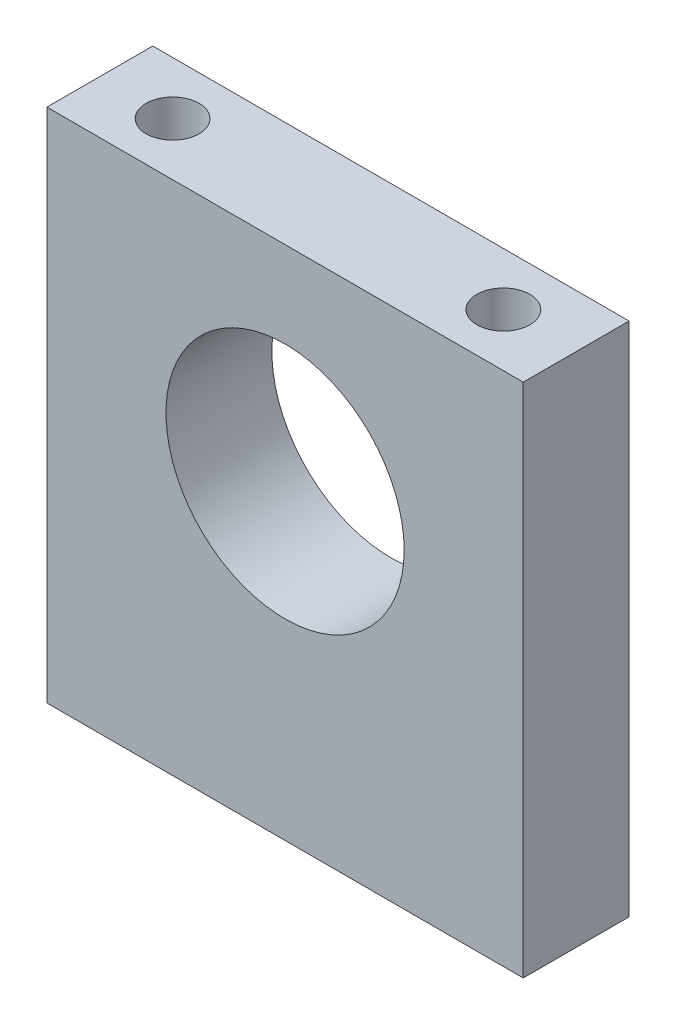
ISO-10303-21;
HEADER;
FILE_DESCRIPTION(('STEP AP214'),'2;1');
FILE_NAME('part.step','',(''),(''),'','','');
FILE_SCHEMA(('AUTOMOTIVE_DESIGN { 1 0 10303 214 1 1 1 1 }'));
ENDSEC;
DATA;
#1=APPLICATION_CONTEXT('core data for automotive mechanical design processes');
#2=APPLICATION_PROTOCOL_DEFINITION('international standard','automotive_design',2000,#1);
#3=PRODUCT_CONTEXT('',#1,'mechanical');
#4=PRODUCT('Part','Part','',(#3));
#5=PRODUCT_RELATED_PRODUCT_CATEGORY('part','',(#4));
#6=PRODUCT_DEFINITION_FORMATION('','',#4);
#7=PRODUCT_DEFINITION_CONTEXT('part definition',#1,'design');
#8=PRODUCT_DEFINITION('design','',#6,#7);
#9=PRODUCT_DEFINITION_SHAPE('','',#8);
#10=(LENGTH_UNIT() NAMED_UNIT(*) SI_UNIT(.MILLI.,.METRE.));
#11=(NAMED_UNIT(*) PLANE_ANGLE_UNIT() SI_UNIT($,.RADIAN.));
#12=(NAMED_UNIT(*) SI_UNIT($,.STERADIAN.) SOLID_ANGLE_UNIT());
#13=UNCERTAINTY_MEASURE_WITH_UNIT(LENGTH_MEASURE(1.E-05),#10,'distance_accuracy_value','');
#14=(GEOMETRIC_REPRESENTATION_CONTEXT(3) GLOBAL_UNCERTAINTY_ASSIGNED_CONTEXT((#13)) GLOBAL_UNIT_ASSIGNED_CONTEXT((#10,
#11,#12)) REPRESENTATION_CONTEXT('',''));
#15=CARTESIAN_POINT('',(0.,0.,0.));
#16=DIRECTION('',(0.,0.,1.));
#17=DIRECTION('',(1.,0.,0.));
#18=AXIS2_PLACEMENT_3D('',#15,#16,#17);
#19=CARTESIAN_POINT('',(0.,39.,0.));
#20=DIRECTION('',(0.,1.,0.));
#21=DIRECTION('',(0.,0.,1.));
#22=AXIS2_PLACEMENT_3D('',#19,#20,#21);
#23=PLANE('',#22);
#24=CARTESIAN_POINT('',(12.5,39.,0.));
#25=DIRECTION('',(0.,1.,0.));
#26=DIRECTION('',(0.,0.,1.));
#27=AXIS2_PLACEMENT_3D('',#24,#25,#26);
#28=CIRCLE('',#27,2.);
#29=CARTESIAN_POINT('',(12.5,39.,2.));
#30=VERTEX_POINT('',#29);
#31=EDGE_CURVE('E111',#30,#30,#28,.T.);
#32=ORIENTED_EDGE('',*,*,#31,.F.);
#33=EDGE_LOOP('',(#32));
#34=FACE_BOUND('',#33,.T.);
#35=DIRECTION('',(0.,0.,-1.));
#36=VECTOR('',#35,1.);
#37=CARTESIAN_POINT('',(18.,39.,-4.));
#38=LINE('',#37,#36);
#39=CARTESIAN_POINT('',(18.,39.,4.));
#40=VERTEX_POINT('',#39);
#41=CARTESIAN_POINT('',(18.,39.,-4.));
#42=VERTEX_POINT('',#41);
#43=EDGE_CURVE('E91',#40,#42,#38,.T.);
#44=ORIENTED_EDGE('',*,*,#43,.T.);
#45=DIRECTION('',(-1.,0.,0.));
#46=VECTOR('',#45,1.);
#47=CARTESIAN_POINT('',(-18.,39.,-4.));
#48=LINE('',#47,#46);
#49=CARTESIAN_POINT('',(-18.,39.,-4.));
#50=VERTEX_POINT('',#49);
#51=EDGE_CURVE('E86',#42,#50,#48,.T.);
#52=ORIENTED_EDGE('',*,*,#51,.T.);
#53=DIRECTION('',(0.,0.,1.));
#54=VECTOR('',#53,1.);
#55=CARTESIAN_POINT('',(-18.,39.,-4.));
#56=LINE('',#55,#54);
#57=CARTESIAN_POINT('',(-18.,39.,4.));
#58=VERTEX_POINT('',#57);
#59=EDGE_CURVE('E89',#50,#58,#56,.T.);
#60=ORIENTED_EDGE('',*,*,#59,.T.);
#61=DIRECTION('',(1.,0.,0.));
#62=VECTOR('',#61,1.);
#63=CARTESIAN_POINT('',(-18.,39.,4.));
#64=LINE('',#63,#62);
#65=EDGE_CURVE('E56',#58,#40,#64,.T.);
#66=ORIENTED_EDGE('',*,*,#65,.T.);
#67=EDGE_LOOP('',(#44,#52,#60,#66));
#68=FACE_BOUND('',#67,.T.);
#69=CARTESIAN_POINT('',(-12.5,39.,0.));
#70=DIRECTION('',(0.,1.,0.));
#71=DIRECTION('',(0.,0.,-1.));
#72=AXIS2_PLACEMENT_3D('',#69,#70,#71);
#73=CIRCLE('',#72,2.);
#74=CARTESIAN_POINT('',(-12.5,39.,-1.99999999999999));
#75=VERTEX_POINT('',#74);
#76=EDGE_CURVE('E133',#75,#75,#73,.T.);
#77=ORIENTED_EDGE('',*,*,#76,.F.);
#78=EDGE_LOOP('',(#77));
#79=FACE_BOUND('',#78,.T.);
#80=ADVANCED_FACE('F38',(#34,#68,#79),#23,.T.);
#81=CARTESIAN_POINT('',(0.,0.,0.));
#82=DIRECTION('',(0.,1.,0.));
#83=DIRECTION('',(0.,0.,1.));
#84=AXIS2_PLACEMENT_3D('',#81,#82,#83);
#85=PLANE('',#84);
#86=DIRECTION('',(0.,0.,-1.));
#87=VECTOR('',#86,1.);
#88=CARTESIAN_POINT('',(18.,0.,-4.));
#89=LINE('',#88,#87);
#90=CARTESIAN_POINT('',(18.,0.,4.));
#91=VERTEX_POINT('',#90);
#92=CARTESIAN_POINT('',(18.,0.,-4.));
#93=VERTEX_POINT('',#92);
#94=EDGE_CURVE('E107',#91,#93,#89,.T.);
#95=ORIENTED_EDGE('',*,*,#94,.F.);
#96=DIRECTION('',(1.,0.,0.));
#97=VECTOR('',#96,1.);
#98=CARTESIAN_POINT('',(-18.,0.,4.));
#99=LINE('',#98,#97);
#100=CARTESIAN_POINT('',(-18.,0.,4.));
#101=VERTEX_POINT('',#100);
#102=EDGE_CURVE('E79',#101,#91,#99,.T.);
#103=ORIENTED_EDGE('',*,*,#102,.F.);
#104=DIRECTION('',(0.,0.,1.));
#105=VECTOR('',#104,1.);
#106=CARTESIAN_POINT('',(-18.,0.,-4.));
#107=LINE('',#106,#105);
#108=CARTESIAN_POINT('',(-18.,0.,-4.));
#109=VERTEX_POINT('',#108);
#110=EDGE_CURVE('E73',#109,#101,#107,.T.);
#111=ORIENTED_EDGE('',*,*,#110,.F.);
#112=DIRECTION('',(-1.,0.,0.));
#113=VECTOR('',#112,1.);
#114=CARTESIAN_POINT('',(-18.,0.,-4.));
#115=LINE('',#114,#113);
#116=EDGE_CURVE('E96',#93,#109,#115,.T.);
#117=ORIENTED_EDGE('',*,*,#116,.F.);
#118=EDGE_LOOP('',(#95,#103,#111,#117));
#119=FACE_BOUND('',#118,.T.);
#120=CARTESIAN_POINT('',(12.5,0.,0.));
#121=DIRECTION('',(0.,1.,0.));
#122=DIRECTION('',(0.,0.,1.));
#123=AXIS2_PLACEMENT_3D('',#120,#121,#122);
#124=CIRCLE('',#123,2.);
#125=CARTESIAN_POINT('',(12.5,0.,2.));
#126=VERTEX_POINT('',#125);
#127=EDGE_CURVE('E129',#126,#126,#124,.T.);
#128=ORIENTED_EDGE('',*,*,#127,.T.);
#129=EDGE_LOOP('',(#128));
#130=FACE_BOUND('',#129,.T.);
#131=CARTESIAN_POINT('',(-12.5,0.,0.));
#132=DIRECTION('',(0.,1.,0.));
#133=DIRECTION('',(0.,0.,-1.));
#134=AXIS2_PLACEMENT_3D('',#131,#132,#133);
#135=CIRCLE('',#134,2.);
#136=CARTESIAN_POINT('',(-12.5,0.,-1.99999999999999));
#137=VERTEX_POINT('',#136);
#138=EDGE_CURVE('E137',#137,#137,#135,.T.);
#139=ORIENTED_EDGE('',*,*,#138,.T.);
#140=EDGE_LOOP('',(#139));
#141=FACE_BOUND('',#140,.T.);
#142=ADVANCED_FACE('F124',(#119,#130,#141),#85,.F.);
#143=CARTESIAN_POINT('',(18.,39.,-4.));
#144=DIRECTION('',(-1.,0.,0.));
#145=DIRECTION('',(0.,0.,1.));
#146=AXIS2_PLACEMENT_3D('',#143,#144,#145);
#147=PLANE('',#146);
#148=ORIENTED_EDGE('',*,*,#94,.T.);
#149=DIRECTION('',(0.,-1.,0.));
#150=VECTOR('',#149,1.);
#151=CARTESIAN_POINT('',(18.,39.,-4.));
#152=LINE('',#151,#150);
#153=EDGE_CURVE('E11',#42,#93,#152,.T.);
#154=ORIENTED_EDGE('',*,*,#153,.F.);
#155=ORIENTED_EDGE('',*,*,#43,.F.);
#156=DIRECTION('',(0.,-1.,0.));
#157=VECTOR('',#156,1.);
#158=CARTESIAN_POINT('',(18.,39.,4.));
#159=LINE('',#158,#157);
#160=EDGE_CURVE('E103',#40,#91,#159,.T.);
#161=ORIENTED_EDGE('',*,*,#160,.T.);
#162=EDGE_LOOP('',(#148,#154,#155,#161));
#163=FACE_BOUND('',#162,.T.);
#164=ADVANCED_FACE('F40',(#163),#147,.F.);
#165=CARTESIAN_POINT('',(-18.,39.,-4.));
#166=DIRECTION('',(0.,0.,1.));
#167=DIRECTION('',(1.,0.,0.));
#168=AXIS2_PLACEMENT_3D('',#165,#166,#167);
#169=PLANE('',#168);
#170=CARTESIAN_POINT('',(0.,23.5,-4.));
#171=DIRECTION('',(0.,0.,1.));
#172=DIRECTION('',(1.,0.,0.));
#173=AXIS2_PLACEMENT_3D('',#170,#171,#172);
#174=CIRCLE('',#173,9.);
#175=CARTESIAN_POINT('',(9.,23.5,-4.));
#176=VERTEX_POINT('',#175);
#177=EDGE_CURVE('E141',#176,#176,#174,.T.);
#178=ORIENTED_EDGE('',*,*,#177,.T.);
#179=EDGE_LOOP('',(#178));
#180=FACE_BOUND('',#179,.T.);
#181=ORIENTED_EDGE('',*,*,#116,.T.);
#182=DIRECTION('',(0.,-1.,0.));
#183=VECTOR('',#182,1.);
#184=CARTESIAN_POINT('',(-18.,39.,-4.));
#185=LINE('',#184,#183);
#186=EDGE_CURVE('E48',#50,#109,#185,.T.);
#187=ORIENTED_EDGE('',*,*,#186,.F.);
#188=ORIENTED_EDGE('',*,*,#51,.F.);
#189=ORIENTED_EDGE('',*,*,#153,.T.);
#190=EDGE_LOOP('',(#181,#187,#188,#189));
#191=FACE_BOUND('',#190,.T.);
#192=ADVANCED_FACE('F95',(#180,#191),#169,.F.);
#193=CARTESIAN_POINT('',(-18.,39.,-4.));
#194=DIRECTION('',(1.,0.,0.));
#195=DIRECTION('',(0.,0.,-1.));
#196=AXIS2_PLACEMENT_3D('',#193,#194,#195);
#197=PLANE('',#196);
#198=ORIENTED_EDGE('',*,*,#110,.T.);
#199=DIRECTION('',(0.,-1.,0.));
#200=VECTOR('',#199,1.);
#201=CARTESIAN_POINT('',(-18.,39.,4.));
#202=LINE('',#201,#200);
#203=EDGE_CURVE('E98',#58,#101,#202,.T.);
#204=ORIENTED_EDGE('',*,*,#203,.F.);
#205=ORIENTED_EDGE('',*,*,#59,.F.);
#206=ORIENTED_EDGE('',*,*,#186,.T.);
#207=EDGE_LOOP('',(#198,#204,#205,#206));
#208=FACE_BOUND('',#207,.T.);
#209=ADVANCED_FACE('F99',(#208),#197,.F.);
#210=CARTESIAN_POINT('',(-18.,39.,4.));
#211=DIRECTION('',(0.,0.,-1.));
#212=DIRECTION('',(-1.,0.,0.));
#213=AXIS2_PLACEMENT_3D('',#210,#211,#212);
#214=PLANE('',#213);
#215=CARTESIAN_POINT('',(0.,23.5,4.));
#216=DIRECTION('',(0.,0.,1.));
#217=DIRECTION('',(1.,0.,0.));
#218=AXIS2_PLACEMENT_3D('',#215,#216,#217);
#219=CIRCLE('',#218,9.);
#220=CARTESIAN_POINT('',(9.,23.5,4.));
#221=VERTEX_POINT('',#220);
#222=EDGE_CURVE('E148',#221,#221,#219,.T.);
#223=ORIENTED_EDGE('',*,*,#222,.F.);
#224=EDGE_LOOP('',(#223));
#225=FACE_BOUND('',#224,.T.);
#226=ORIENTED_EDGE('',*,*,#102,.T.);
#227=ORIENTED_EDGE('',*,*,#160,.F.);
#228=ORIENTED_EDGE('',*,*,#65,.F.);
#229=ORIENTED_EDGE('',*,*,#203,.T.);
#230=EDGE_LOOP('',(#226,#227,#228,#229));
#231=FACE_BOUND('',#230,.T.);
#232=ADVANCED_FACE('F121',(#225,#231),#214,.F.);
#233=CARTESIAN_POINT('',(12.5,39.,0.));
#234=DIRECTION('',(0.,-1.,0.));
#235=DIRECTION('',(0.,0.,-1.));
#236=AXIS2_PLACEMENT_3D('',#233,#234,#235);
#237=CYLINDRICAL_SURFACE('',#236,2.);
#238=ORIENTED_EDGE('',*,*,#31,.T.);
#239=EDGE_LOOP('',(#238));
#240=FACE_BOUND('',#239,.T.);
#241=ORIENTED_EDGE('',*,*,#127,.F.);
#242=EDGE_LOOP('',(#241));
#243=FACE_BOUND('',#242,.T.);
#244=ADVANCED_FACE('F157',(#240,#243),#237,.F.);
#245=CARTESIAN_POINT('',(-12.5,39.,0.));
#246=DIRECTION('',(0.,-1.,0.));
#247=DIRECTION('',(0.,0.,-1.));
#248=AXIS2_PLACEMENT_3D('',#245,#246,#247);
#249=CYLINDRICAL_SURFACE('',#248,2.);
#250=ORIENTED_EDGE('',*,*,#76,.T.);
#251=EDGE_LOOP('',(#250));
#252=FACE_BOUND('',#251,.T.);
#253=ORIENTED_EDGE('',*,*,#138,.F.);
#254=EDGE_LOOP('',(#253));
#255=FACE_BOUND('',#254,.T.);
#256=ADVANCED_FACE('F164',(#252,#255),#249,.F.);
#257=CARTESIAN_POINT('',(0.,23.5,-6.));
#258=DIRECTION('',(0.,0.,1.));
#259=DIRECTION('',(1.,0.,0.));
#260=AXIS2_PLACEMENT_3D('',#257,#258,#259);
#261=CYLINDRICAL_SURFACE('',#260,9.);
#262=ORIENTED_EDGE('',*,*,#222,.T.);
#263=EDGE_LOOP('',(#262));
#264=FACE_BOUND('',#263,.T.);
#265=ORIENTED_EDGE('',*,*,#177,.F.);
#266=EDGE_LOOP('',(#265));
#267=FACE_BOUND('',#266,.T.);
#268=ADVANCED_FACE('F153',(#264,#267),#261,.F.);
#269=CLOSED_SHELL('',(#80,#142,#164,#192,#209,#232,#244,#256,#268));
#270=MANIFOLD_SOLID_BREP('B2',#269);
#271=ADVANCED_BREP_SHAPE_REPRESENTATION('',(#18,#270),#14);
#272=SHAPE_DEFINITION_REPRESENTATION(#9,#271);
ENDSEC;
END-ISO-10303-21;
